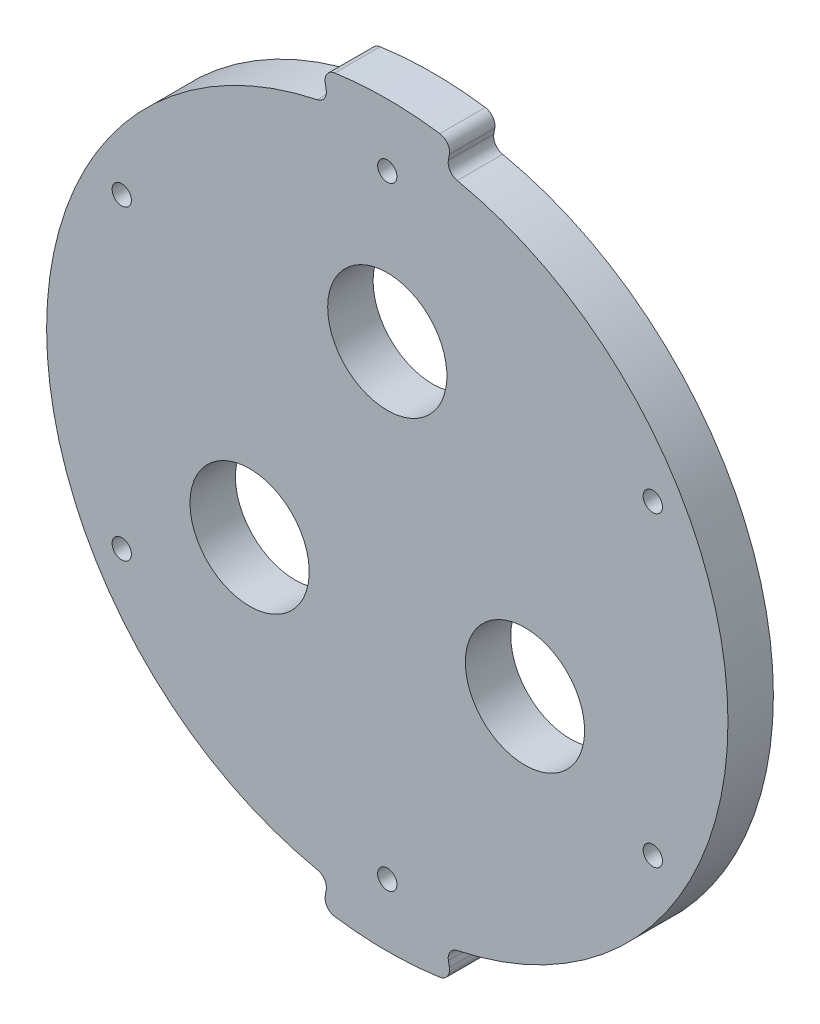
ISO-10303-21;
HEADER;
FILE_DESCRIPTION(('STEP AP214'),'2;1');
FILE_NAME('part.step','',(''),(''),'','','');
FILE_SCHEMA(('AUTOMOTIVE_DESIGN { 1 0 10303 214 1 1 1 1 }'));
ENDSEC;
DATA;
#1=APPLICATION_CONTEXT('core data for automotive mechanical design processes');
#2=APPLICATION_PROTOCOL_DEFINITION('international standard','automotive_design',2000,#1);
#3=PRODUCT_CONTEXT('',#1,'mechanical');
#4=PRODUCT('Part','Part','',(#3));
#5=PRODUCT_RELATED_PRODUCT_CATEGORY('part','',(#4));
#6=PRODUCT_DEFINITION_FORMATION('','',#4);
#7=PRODUCT_DEFINITION_CONTEXT('part definition',#1,'design');
#8=PRODUCT_DEFINITION('design','',#6,#7);
#9=PRODUCT_DEFINITION_SHAPE('','',#8);
#10=(LENGTH_UNIT() NAMED_UNIT(*) SI_UNIT(.MILLI.,.METRE.));
#11=(NAMED_UNIT(*) PLANE_ANGLE_UNIT() SI_UNIT($,.RADIAN.));
#12=(NAMED_UNIT(*) SI_UNIT($,.STERADIAN.) SOLID_ANGLE_UNIT());
#13=UNCERTAINTY_MEASURE_WITH_UNIT(LENGTH_MEASURE(1.E-05),#10,'distance_accuracy_value','');
#14=(GEOMETRIC_REPRESENTATION_CONTEXT(3) GLOBAL_UNCERTAINTY_ASSIGNED_CONTEXT((#13)) GLOBAL_UNIT_ASSIGNED_CONTEXT((#10,
#11,#12)) REPRESENTATION_CONTEXT('',''));
#15=CARTESIAN_POINT('',(0.,0.,0.));
#16=DIRECTION('',(0.,0.,1.));
#17=DIRECTION('',(1.,0.,0.));
#18=AXIS2_PLACEMENT_3D('',#15,#16,#17);
#19=CARTESIAN_POINT('',(0.,0.,0.));
#20=DIRECTION('',(0.,0.,1.));
#21=DIRECTION('',(1.,0.,0.));
#22=AXIS2_PLACEMENT_3D('',#19,#20,#21);
#23=PLANE('',#22);
#24=CARTESIAN_POINT('',(0.,28.,0.));
#25=DIRECTION('',(0.,0.,-1.));
#26=DIRECTION('',(-1.,0.,0.));
#27=AXIS2_PLACEMENT_3D('',#24,#25,#26);
#28=CIRCLE('',#27,10.5);
#29=CARTESIAN_POINT('',(-10.5,28.,0.));
#30=VERTEX_POINT('',#29);
#31=EDGE_CURVE('E827',#30,#30,#28,.T.);
#32=ORIENTED_EDGE('',*,*,#31,.F.);
#33=EDGE_LOOP('',(#32));
#34=FACE_BOUND('',#33,.T.);
#35=CARTESIAN_POINT('',(-24.2487113059661,-13.999999999999,0.));
#36=DIRECTION('',(0.,0.,-1.));
#37=DIRECTION('',(-1.,0.,0.));
#38=AXIS2_PLACEMENT_3D('',#35,#36,#37);
#39=CIRCLE('',#38,10.5000000000015);
#40=CARTESIAN_POINT('',(-34.7487113059676,-13.999999999999,0.));
#41=VERTEX_POINT('',#40);
#42=EDGE_CURVE('E829',#41,#41,#39,.T.);
#43=ORIENTED_EDGE('',*,*,#42,.F.);
#44=EDGE_LOOP('',(#43));
#45=FACE_BOUND('',#44,.T.);
#46=CARTESIAN_POINT('',(24.2487113059625,-14.000000000001,0.));
#47=DIRECTION('',(0.,0.,-1.));
#48=DIRECTION('',(-1.,0.,0.));
#49=AXIS2_PLACEMENT_3D('',#46,#47,#48);
#50=CIRCLE('',#49,10.5000000000023);
#51=CARTESIAN_POINT('',(13.7487113059602,-14.000000000001,0.));
#52=VERTEX_POINT('',#51);
#53=EDGE_CURVE('E844',#52,#52,#50,.T.);
#54=ORIENTED_EDGE('',*,*,#53,.F.);
#55=EDGE_LOOP('',(#54));
#56=FACE_BOUND('',#55,.T.);
#57=CARTESIAN_POINT('',(-46.7653718043612,27.0000000000027,0.));
#58=DIRECTION('',(0.,0.,-1.));
#59=DIRECTION('',(-1.,0.,0.));
#60=AXIS2_PLACEMENT_3D('',#57,#58,#59);
#61=CIRCLE('',#60,1.725);
#62=CARTESIAN_POINT('',(-48.4903718043612,27.0000000000027,0.));
#63=VERTEX_POINT('',#62);
#64=EDGE_CURVE('E867',#63,#63,#61,.T.);
#65=ORIENTED_EDGE('',*,*,#64,.F.);
#66=EDGE_LOOP('',(#65));
#67=FACE_BOUND('',#66,.T.);
#68=CARTESIAN_POINT('',(-6.11887169335264E-12,-54.,0.));
#69=DIRECTION('',(0.,0.,-1.));
#70=DIRECTION('',(-1.,0.,0.));
#71=AXIS2_PLACEMENT_3D('',#68,#69,#70);
#72=CIRCLE('',#71,1.725);
#73=CARTESIAN_POINT('',(-1.72500000000612,-54.,0.));
#74=VERTEX_POINT('',#73);
#75=EDGE_CURVE('E891',#74,#74,#72,.T.);
#76=ORIENTED_EDGE('',*,*,#75,.F.);
#77=EDGE_LOOP('',(#76));
#78=FACE_BOUND('',#77,.T.);
#79=CARTESIAN_POINT('',(0.,0.,0.));
#80=DIRECTION('',(0.,0.,1.));
#81=DIRECTION('',(1.,0.,0.));
#82=AXIS2_PLACEMENT_3D('',#79,#80,#81);
#83=CIRCLE('',#82,65.);
#84=CARTESIAN_POINT('',(9.24929948716635,-64.3385612132935,0.));
#85=VERTEX_POINT('',#84);
#86=CARTESIAN_POINT('',(-9.2492994871958,-64.3385612132892,0.));
#87=VERTEX_POINT('',#86);
#88=EDGE_CURVE('E169',#85,#87,#83,.F.);
#89=ORIENTED_EDGE('',*,*,#88,.T.);
#90=CARTESIAN_POINT('',(-8.96470565682054,-62.3589131759572,0.));
#91=DIRECTION('',(0.,0.,1.));
#92=DIRECTION('',(1.,0.,0.));
#93=AXIS2_PLACEMENT_3D('',#90,#91,#92);
#94=CIRCLE('',#93,2.);
#95=CARTESIAN_POINT('',(-10.9343211628449,-62.0116168206229,0.));
#96=VERTEX_POINT('',#95);
#97=EDGE_CURVE('E163',#87,#96,#94,.F.);
#98=ORIENTED_EDGE('',*,*,#97,.T.);
#99=DIRECTION('',(0.173648177667149,0.984807753012169,0.));
#100=VECTOR('',#99,1.);
#101=CARTESIAN_POINT('',(-10.4188906600289,-59.0884651807302,0.));
#102=LINE('',#101,#100);
#103=CARTESIAN_POINT('',(-10.7605840032661,-61.0263044261133,0.));
#104=VERTEX_POINT('',#103);
#105=EDGE_CURVE('E166',#96,#104,#102,.T.);
#106=ORIENTED_EDGE('',*,*,#105,.T.);
#107=CARTESIAN_POINT('',(-12.7301995092905,-60.679008070779,0.));
#108=DIRECTION('',(0.,0.,1.));
#109=DIRECTION('',(1.,0.,0.));
#110=AXIS2_PLACEMENT_3D('',#107,#108,#109);
#111=CIRCLE('',#110,2.);
#112=CARTESIAN_POINT('',(-12.3195479122166,-58.7216207136571,0.));
#113=VERTEX_POINT('',#112);
#114=EDGE_CURVE('E327',#104,#113,#111,.T.);
#115=ORIENTED_EDGE('',*,*,#114,.T.);
#116=CARTESIAN_POINT('',(0.,0.,0.));
#117=DIRECTION('',(0.,0.,1.));
#118=DIRECTION('',(1.,0.,0.));
#119=AXIS2_PLACEMENT_3D('',#116,#117,#118);
#120=CIRCLE('',#119,60.);
#121=CARTESIAN_POINT('',(-12.3195479122032,58.7216207136599,0.));
#122=VERTEX_POINT('',#121);
#123=EDGE_CURVE('E228',#122,#113,#120,.T.);
#124=ORIENTED_EDGE('',*,*,#123,.F.);
#125=CARTESIAN_POINT('',(-12.7301995092766,60.6790080707819,0.));
#126=DIRECTION('',(0.,0.,1.));
#127=DIRECTION('',(1.,0.,0.));
#128=AXIS2_PLACEMENT_3D('',#125,#126,#127);
#129=CIRCLE('',#128,2.);
#130=CARTESIAN_POINT('',(-10.7605840032522,61.0263044261157,0.));
#131=VERTEX_POINT('',#130);
#132=EDGE_CURVE('E12',#122,#131,#129,.T.);
#133=ORIENTED_EDGE('',*,*,#132,.T.);
#134=DIRECTION('',(-0.173648177666924,0.984807753012209,0.));
#135=VECTOR('',#134,1.);
#136=CARTESIAN_POINT('',(-10.4188906600154,59.0884651807326,0.));
#137=LINE('',#136,#135);
#138=CARTESIAN_POINT('',(-10.9343211628307,62.0116168206254,0.));
#139=VERTEX_POINT('',#138);
#140=EDGE_CURVE('E223',#131,#139,#137,.T.);
#141=ORIENTED_EDGE('',*,*,#140,.T.);
#142=CARTESIAN_POINT('',(-8.96470565680627,62.3589131759593,0.));
#143=DIRECTION('',(0.,0.,1.));
#144=DIRECTION('',(1.,0.,0.));
#145=AXIS2_PLACEMENT_3D('',#142,#143,#144);
#146=CIRCLE('',#145,2.);
#147=CARTESIAN_POINT('',(-9.24929948718107,64.3385612132913,0.));
#148=VERTEX_POINT('',#147);
#149=EDGE_CURVE('E276',#139,#148,#146,.F.);
#150=ORIENTED_EDGE('',*,*,#149,.T.);
#151=CARTESIAN_POINT('',(0.,0.,0.));
#152=DIRECTION('',(0.,0.,1.));
#153=DIRECTION('',(1.,0.,0.));
#154=AXIS2_PLACEMENT_3D('',#151,#152,#153);
#155=CIRCLE('',#154,65.);
#156=CARTESIAN_POINT('',(9.24929948718107,64.3385612132913,0.));
#157=VERTEX_POINT('',#156);
#158=EDGE_CURVE('E215',#148,#157,#155,.F.);
#159=ORIENTED_EDGE('',*,*,#158,.T.);
#160=CARTESIAN_POINT('',(8.96470565680627,62.3589131759593,0.));
#161=DIRECTION('',(0.,0.,1.));
#162=DIRECTION('',(1.,0.,0.));
#163=AXIS2_PLACEMENT_3D('',#160,#161,#162);
#164=CIRCLE('',#163,2.);
#165=CARTESIAN_POINT('',(10.9343211628307,62.0116168206254,0.));
#166=VERTEX_POINT('',#165);
#167=EDGE_CURVE('E279',#157,#166,#164,.F.);
#168=ORIENTED_EDGE('',*,*,#167,.T.);
#169=DIRECTION('',(-0.173648177666923,-0.984807753012209,0.));
#170=VECTOR('',#169,1.);
#171=CARTESIAN_POINT('',(10.4188906600154,59.0884651807326,0.));
#172=LINE('',#171,#170);
#173=CARTESIAN_POINT('',(10.7605840032522,61.0263044261157,0.));
#174=VERTEX_POINT('',#173);
#175=EDGE_CURVE('E219',#166,#174,#172,.T.);
#176=ORIENTED_EDGE('',*,*,#175,.T.);
#177=CARTESIAN_POINT('',(12.7301995092766,60.6790080707819,0.));
#178=DIRECTION('',(0.,0.,1.));
#179=DIRECTION('',(1.,0.,0.));
#180=AXIS2_PLACEMENT_3D('',#177,#178,#179);
#181=CIRCLE('',#180,2.);
#182=CARTESIAN_POINT('',(12.3195479122032,58.7216207136599,0.));
#183=VERTEX_POINT('',#182);
#184=EDGE_CURVE('E338',#174,#183,#181,.T.);
#185=ORIENTED_EDGE('',*,*,#184,.T.);
#186=CARTESIAN_POINT('',(12.3195479121897,-58.7216207136627,0.));
#187=VERTEX_POINT('',#186);
#188=EDGE_CURVE('E222',#187,#183,#120,.T.);
#189=ORIENTED_EDGE('',*,*,#188,.F.);
#190=CARTESIAN_POINT('',(12.7301995092627,-60.6790080707848,0.));
#191=DIRECTION('',(0.,0.,1.));
#192=DIRECTION('',(1.,0.,0.));
#193=AXIS2_PLACEMENT_3D('',#190,#191,#192);
#194=CIRCLE('',#193,2.);
#195=CARTESIAN_POINT('',(10.7605840032382,-61.0263044261182,0.));
#196=VERTEX_POINT('',#195);
#197=EDGE_CURVE('E71',#187,#196,#194,.T.);
#198=ORIENTED_EDGE('',*,*,#197,.T.);
#199=DIRECTION('',(0.173648177666698,-0.984807753012249,0.));
#200=VECTOR('',#199,1.);
#201=CARTESIAN_POINT('',(10.4188906600019,-59.0884651807349,0.));
#202=LINE('',#201,#200);
#203=CARTESIAN_POINT('',(10.9343211628165,-62.0116168206279,0.));
#204=VERTEX_POINT('',#203);
#205=EDGE_CURVE('E186',#196,#204,#202,.T.);
#206=ORIENTED_EDGE('',*,*,#205,.T.);
#207=CARTESIAN_POINT('',(8.964705656792,-62.3589131759613,0.));
#208=DIRECTION('',(0.,0.,1.));
#209=DIRECTION('',(1.,0.,0.));
#210=AXIS2_PLACEMENT_3D('',#207,#208,#209);
#211=CIRCLE('',#210,2.);
#212=EDGE_CURVE('E175',#204,#85,#211,.F.);
#213=ORIENTED_EDGE('',*,*,#212,.T.);
#214=EDGE_LOOP('',(#89,#98,#106,#115,#124,#133,#141,#150,#159,#168,#176,#185,#189,#198,#206,#213));
#215=FACE_BOUND('',#214,.T.);
#216=CARTESIAN_POINT('',(46.7653718043582,26.9999999999974,0.));
#217=DIRECTION('',(0.,0.,-1.));
#218=DIRECTION('',(-1.,0.,0.));
#219=AXIS2_PLACEMENT_3D('',#216,#217,#218);
#220=CIRCLE('',#219,1.725);
#221=CARTESIAN_POINT('',(45.0403718043582,26.9999999999974,0.));
#222=VERTEX_POINT('',#221);
#223=EDGE_CURVE('E409',#222,#222,#220,.T.);
#224=ORIENTED_EDGE('',*,*,#223,.F.);
#225=EDGE_LOOP('',(#224));
#226=FACE_BOUND('',#225,.T.);
#227=CARTESIAN_POINT('',(46.7653718043551,-27.0000000000027,0.));
#228=DIRECTION('',(0.,0.,-1.));
#229=DIRECTION('',(-1.,0.,0.));
#230=AXIS2_PLACEMENT_3D('',#227,#228,#229);
#231=CIRCLE('',#230,1.725);
#232=CARTESIAN_POINT('',(45.0403718043551,-27.0000000000027,0.));
#233=VERTEX_POINT('',#232);
#234=EDGE_CURVE('E430',#233,#233,#231,.T.);
#235=ORIENTED_EDGE('',*,*,#234,.F.);
#236=EDGE_LOOP('',(#235));
#237=FACE_BOUND('',#236,.T.);
#238=CARTESIAN_POINT('',(-46.7653718043643,-26.9999999999973,0.));
#239=DIRECTION('',(0.,0.,-1.));
#240=DIRECTION('',(-1.,0.,0.));
#241=AXIS2_PLACEMENT_3D('',#238,#239,#240);
#242=CIRCLE('',#241,1.725);
#243=CARTESIAN_POINT('',(-48.4903718043643,-26.9999999999973,0.));
#244=VERTEX_POINT('',#243);
#245=EDGE_CURVE('E880',#244,#244,#242,.T.);
#246=ORIENTED_EDGE('',*,*,#245,.F.);
#247=EDGE_LOOP('',(#246));
#248=FACE_BOUND('',#247,.T.);
#249=CARTESIAN_POINT('',(0.,54.,0.));
#250=DIRECTION('',(0.,0.,-1.));
#251=DIRECTION('',(-1.,0.,0.));
#252=AXIS2_PLACEMENT_3D('',#249,#250,#251);
#253=CIRCLE('',#252,1.725);
#254=CARTESIAN_POINT('',(-1.725,54.,0.));
#255=VERTEX_POINT('',#254);
#256=EDGE_CURVE('E833',#255,#255,#253,.T.);
#257=ORIENTED_EDGE('',*,*,#256,.F.);
#258=EDGE_LOOP('',(#257));
#259=FACE_BOUND('',#258,.T.);
#260=ADVANCED_FACE('F48',(#34,#45,#56,#67,#78,#215,#226,#237,#248,#259),#23,.F.);
#261=CARTESIAN_POINT('',(0.,0.,8.));
#262=DIRECTION('',(0.,0.,-1.));
#263=DIRECTION('',(-1.,0.,0.));
#264=AXIS2_PLACEMENT_3D('',#261,#262,#263);
#265=CYLINDRICAL_SURFACE('',#264,60.);
#266=CARTESIAN_POINT('',(0.,0.,8.));
#267=DIRECTION('',(0.,0.,1.));
#268=DIRECTION('',(1.,0.,0.));
#269=AXIS2_PLACEMENT_3D('',#266,#267,#268);
#270=CIRCLE('',#269,60.);
#271=CARTESIAN_POINT('',(12.3195479121897,-58.7216207136627,8.));
#272=VERTEX_POINT('',#271);
#273=CARTESIAN_POINT('',(12.3195479122032,58.7216207136599,8.));
#274=VERTEX_POINT('',#273);
#275=EDGE_CURVE('E224',#272,#274,#270,.T.);
#276=ORIENTED_EDGE('',*,*,#275,.F.);
#277=DIRECTION('',(0.,0.,-1.));
#278=VECTOR('',#277,1.);
#279=CARTESIAN_POINT('',(12.3195479121897,-58.7216207136627,8.));
#280=LINE('',#279,#278);
#281=EDGE_CURVE('E300',#272,#187,#280,.T.);
#282=ORIENTED_EDGE('',*,*,#281,.T.);
#283=ORIENTED_EDGE('',*,*,#188,.T.);
#284=DIRECTION('',(0.,0.,-1.));
#285=VECTOR('',#284,1.);
#286=CARTESIAN_POINT('',(12.3195479122032,58.7216207136599,8.));
#287=LINE('',#286,#285);
#288=EDGE_CURVE('E296',#183,#274,#287,.F.);
#289=ORIENTED_EDGE('',*,*,#288,.T.);
#290=EDGE_LOOP('',(#276,#282,#283,#289));
#291=FACE_BOUND('',#290,.T.);
#292=ADVANCED_FACE('F386',(#291),#265,.T.);
#293=ORIENTED_EDGE('',*,*,#123,.T.);
#294=DIRECTION('',(0.,0.,-1.));
#295=VECTOR('',#294,1.);
#296=CARTESIAN_POINT('',(-12.3195479122166,-58.7216207136571,8.));
#297=LINE('',#296,#295);
#298=CARTESIAN_POINT('',(-12.3195479122166,-58.7216207136571,8.));
#299=VERTEX_POINT('',#298);
#300=EDGE_CURVE('E286',#113,#299,#297,.F.);
#301=ORIENTED_EDGE('',*,*,#300,.T.);
#302=CARTESIAN_POINT('',(-12.3195479122032,58.7216207136599,8.));
#303=VERTEX_POINT('',#302);
#304=EDGE_CURVE('E198',#303,#299,#270,.T.);
#305=ORIENTED_EDGE('',*,*,#304,.F.);
#306=DIRECTION('',(0.,0.,-1.));
#307=VECTOR('',#306,1.);
#308=CARTESIAN_POINT('',(-12.3195479122032,58.7216207136599,8.));
#309=LINE('',#308,#307);
#310=EDGE_CURVE('E174',#303,#122,#309,.T.);
#311=ORIENTED_EDGE('',*,*,#310,.T.);
#312=EDGE_LOOP('',(#293,#301,#305,#311));
#313=FACE_BOUND('',#312,.T.);
#314=ADVANCED_FACE('F351',(#313),#265,.T.);
#315=CARTESIAN_POINT('',(0.,0.,8.));
#316=DIRECTION('',(0.,0.,1.));
#317=DIRECTION('',(1.,0.,0.));
#318=AXIS2_PLACEMENT_3D('',#315,#316,#317);
#319=PLANE('',#318);
#320=CARTESIAN_POINT('',(0.,28.,8.));
#321=DIRECTION('',(0.,0.,-1.));
#322=DIRECTION('',(-1.,0.,0.));
#323=AXIS2_PLACEMENT_3D('',#320,#321,#322);
#324=CIRCLE('',#323,10.5);
#325=CARTESIAN_POINT('',(-10.5,28.,8.));
#326=VERTEX_POINT('',#325);
#327=EDGE_CURVE('E825',#326,#326,#324,.T.);
#328=ORIENTED_EDGE('',*,*,#327,.T.);
#329=EDGE_LOOP('',(#328));
#330=FACE_BOUND('',#329,.T.);
#331=CARTESIAN_POINT('',(-24.2487113059661,-13.999999999999,8.));
#332=DIRECTION('',(0.,0.,-1.));
#333=DIRECTION('',(-1.,0.,0.));
#334=AXIS2_PLACEMENT_3D('',#331,#332,#333);
#335=CIRCLE('',#334,10.5000000000015);
#336=CARTESIAN_POINT('',(-34.7487113059676,-13.999999999999,8.));
#337=VERTEX_POINT('',#336);
#338=EDGE_CURVE('E836',#337,#337,#335,.T.);
#339=ORIENTED_EDGE('',*,*,#338,.T.);
#340=EDGE_LOOP('',(#339));
#341=FACE_BOUND('',#340,.T.);
#342=CARTESIAN_POINT('',(24.2487113059625,-14.000000000001,8.));
#343=DIRECTION('',(0.,0.,-1.));
#344=DIRECTION('',(-1.,0.,0.));
#345=AXIS2_PLACEMENT_3D('',#342,#343,#344);
#346=CIRCLE('',#345,10.5000000000023);
#347=CARTESIAN_POINT('',(13.7487113059602,-14.000000000001,8.));
#348=VERTEX_POINT('',#347);
#349=EDGE_CURVE('E851',#348,#348,#346,.T.);
#350=ORIENTED_EDGE('',*,*,#349,.T.);
#351=EDGE_LOOP('',(#350));
#352=FACE_BOUND('',#351,.T.);
#353=CARTESIAN_POINT('',(0.,54.,8.));
#354=DIRECTION('',(0.,0.,1.));
#355=DIRECTION('',(1.,0.,0.));
#356=AXIS2_PLACEMENT_3D('',#353,#354,#355);
#357=CIRCLE('',#356,1.69999999999999);
#358=CARTESIAN_POINT('',(1.69999999999999,54.,8.));
#359=VERTEX_POINT('',#358);
#360=EDGE_CURVE('E862',#359,#359,#357,.T.);
#361=ORIENTED_EDGE('',*,*,#360,.F.);
#362=EDGE_LOOP('',(#361));
#363=FACE_BOUND('',#362,.T.);
#364=CARTESIAN_POINT('',(-46.7653718043612,27.0000000000027,8.));
#365=DIRECTION('',(0.,0.,1.));
#366=DIRECTION('',(1.,0.,0.));
#367=AXIS2_PLACEMENT_3D('',#364,#365,#366);
#368=CIRCLE('',#367,1.69999999999999);
#369=CARTESIAN_POINT('',(-45.0653718043612,27.0000000000027,8.));
#370=VERTEX_POINT('',#369);
#371=EDGE_CURVE('E875',#370,#370,#368,.T.);
#372=ORIENTED_EDGE('',*,*,#371,.F.);
#373=EDGE_LOOP('',(#372));
#374=FACE_BOUND('',#373,.T.);
#375=CARTESIAN_POINT('',(-46.7653718043643,-26.9999999999973,8.));
#376=DIRECTION('',(0.,0.,1.));
#377=DIRECTION('',(1.,0.,0.));
#378=AXIS2_PLACEMENT_3D('',#375,#376,#377);
#379=CIRCLE('',#378,1.69999999999999);
#380=CARTESIAN_POINT('',(-45.0653718043643,-26.9999999999973,8.));
#381=VERTEX_POINT('',#380);
#382=EDGE_CURVE('E887',#381,#381,#379,.T.);
#383=ORIENTED_EDGE('',*,*,#382,.F.);
#384=EDGE_LOOP('',(#383));
#385=FACE_BOUND('',#384,.T.);
#386=CARTESIAN_POINT('',(-6.11887169335264E-12,-54.,8.));
#387=DIRECTION('',(0.,0.,1.));
#388=DIRECTION('',(1.,0.,0.));
#389=AXIS2_PLACEMENT_3D('',#386,#387,#388);
#390=CIRCLE('',#389,1.69999999999999);
#391=CARTESIAN_POINT('',(1.69999999999387,-54.,8.));
#392=VERTEX_POINT('',#391);
#393=EDGE_CURVE('E425',#392,#392,#390,.T.);
#394=ORIENTED_EDGE('',*,*,#393,.F.);
#395=EDGE_LOOP('',(#394));
#396=FACE_BOUND('',#395,.T.);
#397=CARTESIAN_POINT('',(46.7653718043551,-27.0000000000027,8.));
#398=DIRECTION('',(0.,0.,1.));
#399=DIRECTION('',(1.,0.,0.));
#400=AXIS2_PLACEMENT_3D('',#397,#398,#399);
#401=CIRCLE('',#400,1.69999999999999);
#402=CARTESIAN_POINT('',(48.4653718043551,-27.0000000000027,8.));
#403=VERTEX_POINT('',#402);
#404=EDGE_CURVE('E413',#403,#403,#401,.T.);
#405=ORIENTED_EDGE('',*,*,#404,.F.);
#406=EDGE_LOOP('',(#405));
#407=FACE_BOUND('',#406,.T.);
#408=CARTESIAN_POINT('',(46.7653718043582,26.9999999999974,8.));
#409=DIRECTION('',(0.,0.,1.));
#410=DIRECTION('',(1.,0.,0.));
#411=AXIS2_PLACEMENT_3D('',#408,#409,#410);
#412=CIRCLE('',#411,1.69999999999999);
#413=CARTESIAN_POINT('',(48.4653718043582,26.9999999999974,8.));
#414=VERTEX_POINT('',#413);
#415=EDGE_CURVE('E187',#414,#414,#412,.T.);
#416=ORIENTED_EDGE('',*,*,#415,.F.);
#417=EDGE_LOOP('',(#416));
#418=FACE_BOUND('',#417,.T.);
#419=DIRECTION('',(-0.173648177667149,-0.984807753012169,0.));
#420=VECTOR('',#419,1.);
#421=CARTESIAN_POINT('',(-10.4188906600289,-59.0884651807302,8.));
#422=LINE('',#421,#420);
#423=CARTESIAN_POINT('',(-10.7605840032661,-61.0263044261133,8.));
#424=VERTEX_POINT('',#423);
#425=CARTESIAN_POINT('',(-10.9343211628449,-62.0116168206229,8.));
#426=VERTEX_POINT('',#425);
#427=EDGE_CURVE('E240',#424,#426,#422,.T.);
#428=ORIENTED_EDGE('',*,*,#427,.T.);
#429=CARTESIAN_POINT('',(-8.96470565682054,-62.3589131759572,8.));
#430=DIRECTION('',(0.,0.,1.));
#431=DIRECTION('',(1.,0.,0.));
#432=AXIS2_PLACEMENT_3D('',#429,#430,#431);
#433=CIRCLE('',#432,2.);
#434=CARTESIAN_POINT('',(-9.2492994871958,-64.3385612132892,8.));
#435=VERTEX_POINT('',#434);
#436=EDGE_CURVE('E190',#426,#435,#433,.T.);
#437=ORIENTED_EDGE('',*,*,#436,.T.);
#438=CARTESIAN_POINT('',(0.,0.,8.));
#439=DIRECTION('',(0.,0.,1.));
#440=DIRECTION('',(-1.,0.,0.));
#441=AXIS2_PLACEMENT_3D('',#438,#439,#440);
#442=CIRCLE('',#441,65.);
#443=CARTESIAN_POINT('',(9.24929948716635,-64.3385612132935,8.));
#444=VERTEX_POINT('',#443);
#445=EDGE_CURVE('E255',#435,#444,#442,.T.);
#446=ORIENTED_EDGE('',*,*,#445,.T.);
#447=CARTESIAN_POINT('',(8.964705656792,-62.3589131759613,8.));
#448=DIRECTION('',(0.,0.,1.));
#449=DIRECTION('',(1.,0.,0.));
#450=AXIS2_PLACEMENT_3D('',#447,#448,#449);
#451=CIRCLE('',#450,2.);
#452=CARTESIAN_POINT('',(10.9343211628165,-62.0116168206279,8.));
#453=VERTEX_POINT('',#452);
#454=EDGE_CURVE('E268',#444,#453,#451,.T.);
#455=ORIENTED_EDGE('',*,*,#454,.T.);
#456=DIRECTION('',(-0.173648177666698,0.984807753012249,0.));
#457=VECTOR('',#456,1.);
#458=CARTESIAN_POINT('',(10.4188906600019,-59.0884651807349,8.));
#459=LINE('',#458,#457);
#460=CARTESIAN_POINT('',(10.7605840032382,-61.0263044261182,8.));
#461=VERTEX_POINT('',#460);
#462=EDGE_CURVE('E249',#453,#461,#459,.T.);
#463=ORIENTED_EDGE('',*,*,#462,.T.);
#464=CARTESIAN_POINT('',(12.7301995092627,-60.6790080707848,8.));
#465=DIRECTION('',(0.,0.,1.));
#466=DIRECTION('',(1.,0.,0.));
#467=AXIS2_PLACEMENT_3D('',#464,#465,#466);
#468=CIRCLE('',#467,2.);
#469=EDGE_CURVE('E330',#461,#272,#468,.F.);
#470=ORIENTED_EDGE('',*,*,#469,.T.);
#471=ORIENTED_EDGE('',*,*,#275,.T.);
#472=CARTESIAN_POINT('',(12.7301995092766,60.6790080707819,8.));
#473=DIRECTION('',(0.,0.,1.));
#474=DIRECTION('',(1.,0.,0.));
#475=AXIS2_PLACEMENT_3D('',#472,#473,#474);
#476=CIRCLE('',#475,2.);
#477=CARTESIAN_POINT('',(10.7605840032522,61.0263044261157,8.));
#478=VERTEX_POINT('',#477);
#479=EDGE_CURVE('E335',#274,#478,#476,.F.);
#480=ORIENTED_EDGE('',*,*,#479,.T.);
#481=DIRECTION('',(0.173648177666923,0.984807753012209,0.));
#482=VECTOR('',#481,1.);
#483=CARTESIAN_POINT('',(10.4188906600154,59.0884651807326,8.));
#484=LINE('',#483,#482);
#485=CARTESIAN_POINT('',(10.9343211628307,62.0116168206254,8.));
#486=VERTEX_POINT('',#485);
#487=EDGE_CURVE('E235',#478,#486,#484,.T.);
#488=ORIENTED_EDGE('',*,*,#487,.T.);
#489=CARTESIAN_POINT('',(8.96470565680627,62.3589131759593,8.));
#490=DIRECTION('',(0.,0.,1.));
#491=DIRECTION('',(1.,0.,0.));
#492=AXIS2_PLACEMENT_3D('',#489,#490,#491);
#493=CIRCLE('',#492,2.);
#494=CARTESIAN_POINT('',(9.24929948718107,64.3385612132913,8.));
#495=VERTEX_POINT('',#494);
#496=EDGE_CURVE('E196',#486,#495,#493,.T.);
#497=ORIENTED_EDGE('',*,*,#496,.T.);
#498=CARTESIAN_POINT('',(0.,0.,8.));
#499=DIRECTION('',(0.,0.,1.));
#500=DIRECTION('',(-1.,0.,0.));
#501=AXIS2_PLACEMENT_3D('',#498,#499,#500);
#502=CIRCLE('',#501,65.);
#503=CARTESIAN_POINT('',(-9.24929948718107,64.3385612132913,8.));
#504=VERTEX_POINT('',#503);
#505=EDGE_CURVE('E216',#495,#504,#502,.T.);
#506=ORIENTED_EDGE('',*,*,#505,.T.);
#507=CARTESIAN_POINT('',(-8.96470565680627,62.3589131759593,8.));
#508=DIRECTION('',(0.,0.,1.));
#509=DIRECTION('',(1.,0.,0.));
#510=AXIS2_PLACEMENT_3D('',#507,#508,#509);
#511=CIRCLE('',#510,2.);
#512=CARTESIAN_POINT('',(-10.9343211628307,62.0116168206254,8.));
#513=VERTEX_POINT('',#512);
#514=EDGE_CURVE('E192',#504,#513,#511,.T.);
#515=ORIENTED_EDGE('',*,*,#514,.T.);
#516=DIRECTION('',(0.173648177666924,-0.984807753012209,0.));
#517=VECTOR('',#516,1.);
#518=CARTESIAN_POINT('',(-10.4188906600154,59.0884651807326,8.));
#519=LINE('',#518,#517);
#520=CARTESIAN_POINT('',(-10.7605840032522,61.0263044261157,8.));
#521=VERTEX_POINT('',#520);
#522=EDGE_CURVE('E210',#513,#521,#519,.T.);
#523=ORIENTED_EDGE('',*,*,#522,.T.);
#524=CARTESIAN_POINT('',(-12.7301995092766,60.6790080707819,8.));
#525=DIRECTION('',(0.,0.,1.));
#526=DIRECTION('',(1.,0.,0.));
#527=AXIS2_PLACEMENT_3D('',#524,#525,#526);
#528=CIRCLE('',#527,2.);
#529=EDGE_CURVE('E57',#521,#303,#528,.F.);
#530=ORIENTED_EDGE('',*,*,#529,.T.);
#531=ORIENTED_EDGE('',*,*,#304,.T.);
#532=CARTESIAN_POINT('',(-12.7301995092905,-60.679008070779,8.));
#533=DIRECTION('',(0.,0.,1.));
#534=DIRECTION('',(1.,0.,0.));
#535=AXIS2_PLACEMENT_3D('',#532,#533,#534);
#536=CIRCLE('',#535,2.);
#537=EDGE_CURVE('E324',#299,#424,#536,.F.);
#538=ORIENTED_EDGE('',*,*,#537,.T.);
#539=EDGE_LOOP('',(#428,#437,#446,#455,#463,#470,#471,#480,#488,#497,#506,#515,#523,#530,#531,#538));
#540=FACE_BOUND('',#539,.T.);
#541=ADVANCED_FACE('F344',(#330,#341,#352,#363,#374,#385,#396,#407,#418,#540),#319,.T.);
#542=CARTESIAN_POINT('',(-10.4188906600154,59.0884651807326,-23.3354579616187));
#543=DIRECTION('',(-0.984807753012209,-0.173648177666924,0.));
#544=DIRECTION('',(0.173648177666924,-0.984807753012209,0.));
#545=AXIS2_PLACEMENT_3D('',#542,#543,#544);
#546=PLANE('',#545);
#547=ORIENTED_EDGE('',*,*,#522,.F.);
#548=DIRECTION('',(0.,0.,1.));
#549=VECTOR('',#548,1.);
#550=CARTESIAN_POINT('',(-10.9343211628307,62.0116168206254,-23.3354579616187));
#551=LINE('',#550,#549);
#552=EDGE_CURVE('E321',#513,#139,#551,.F.);
#553=ORIENTED_EDGE('',*,*,#552,.T.);
#554=ORIENTED_EDGE('',*,*,#140,.F.);
#555=DIRECTION('',(0.,0.,-1.));
#556=VECTOR('',#555,1.);
#557=CARTESIAN_POINT('',(-10.7605840032522,61.0263044261157,-23.3354579616187));
#558=LINE('',#557,#556);
#559=EDGE_CURVE('E317',#131,#521,#558,.F.);
#560=ORIENTED_EDGE('',*,*,#559,.T.);
#561=EDGE_LOOP('',(#547,#553,#554,#560));
#562=FACE_BOUND('',#561,.T.);
#563=ADVANCED_FACE('F359',(#562),#546,.T.);
#564=CARTESIAN_POINT('',(0.,0.,-23.3354579616187));
#565=DIRECTION('',(0.,0.,1.));
#566=DIRECTION('',(1.,0.,0.));
#567=AXIS2_PLACEMENT_3D('',#564,#565,#566);
#568=CYLINDRICAL_SURFACE('',#567,65.);
#569=ORIENTED_EDGE('',*,*,#505,.F.);
#570=DIRECTION('',(0.,0.,1.));
#571=VECTOR('',#570,1.);
#572=CARTESIAN_POINT('',(9.24929948718107,64.3385612132913,-23.3354579616187));
#573=LINE('',#572,#571);
#574=EDGE_CURVE('E314',#495,#157,#573,.F.);
#575=ORIENTED_EDGE('',*,*,#574,.T.);
#576=ORIENTED_EDGE('',*,*,#158,.F.);
#577=DIRECTION('',(0.,0.,1.));
#578=VECTOR('',#577,1.);
#579=CARTESIAN_POINT('',(-9.24929948718107,64.3385612132913,-23.3354579616187));
#580=LINE('',#579,#578);
#581=EDGE_CURVE('E310',#148,#504,#580,.T.);
#582=ORIENTED_EDGE('',*,*,#581,.T.);
#583=EDGE_LOOP('',(#569,#575,#576,#582));
#584=FACE_BOUND('',#583,.T.);
#585=ADVANCED_FACE('F368',(#584),#568,.T.);
#586=CARTESIAN_POINT('',(10.4188906600154,59.0884651807326,-23.3354579616187));
#587=DIRECTION('',(0.984807753012209,-0.173648177666923,0.));
#588=DIRECTION('',(0.173648177666923,0.984807753012209,0.));
#589=AXIS2_PLACEMENT_3D('',#586,#587,#588);
#590=PLANE('',#589);
#591=ORIENTED_EDGE('',*,*,#487,.F.);
#592=DIRECTION('',(0.,0.,-1.));
#593=VECTOR('',#592,1.);
#594=CARTESIAN_POINT('',(10.7605840032522,61.0263044261157,-23.3354579616187));
#595=LINE('',#594,#593);
#596=EDGE_CURVE('E307',#478,#174,#595,.T.);
#597=ORIENTED_EDGE('',*,*,#596,.T.);
#598=ORIENTED_EDGE('',*,*,#175,.F.);
#599=DIRECTION('',(0.,0.,1.));
#600=VECTOR('',#599,1.);
#601=CARTESIAN_POINT('',(10.9343211628307,62.0116168206254,-23.3354579616187));
#602=LINE('',#601,#600);
#603=EDGE_CURVE('E303',#166,#486,#602,.T.);
#604=ORIENTED_EDGE('',*,*,#603,.T.);
#605=EDGE_LOOP('',(#591,#597,#598,#604));
#606=FACE_BOUND('',#605,.T.);
#607=ADVANCED_FACE('F378',(#606),#590,.T.);
#608=CARTESIAN_POINT('',(10.4188906600019,-59.0884651807349,-23.3354579616187));
#609=DIRECTION('',(0.984807753012249,0.173648177666698,0.));
#610=DIRECTION('',(-0.173648177666698,0.984807753012249,0.));
#611=AXIS2_PLACEMENT_3D('',#608,#609,#610);
#612=PLANE('',#611);
#613=ORIENTED_EDGE('',*,*,#462,.F.);
#614=DIRECTION('',(0.,0.,1.));
#615=VECTOR('',#614,1.);
#616=CARTESIAN_POINT('',(10.9343211628165,-62.0116168206279,-23.3354579616187));
#617=LINE('',#616,#615);
#618=EDGE_CURVE('E64',#453,#204,#617,.F.);
#619=ORIENTED_EDGE('',*,*,#618,.T.);
#620=ORIENTED_EDGE('',*,*,#205,.F.);
#621=DIRECTION('',(0.,0.,-1.));
#622=VECTOR('',#621,1.);
#623=CARTESIAN_POINT('',(10.7605840032382,-61.0263044261182,-23.3354579616187));
#624=LINE('',#623,#622);
#625=EDGE_CURVE('E290',#196,#461,#624,.F.);
#626=ORIENTED_EDGE('',*,*,#625,.T.);
#627=EDGE_LOOP('',(#613,#619,#620,#626));
#628=FACE_BOUND('',#627,.T.);
#629=ADVANCED_FACE('F506',(#628),#612,.T.);
#630=CARTESIAN_POINT('',(0.,0.,-23.3354579616187));
#631=DIRECTION('',(0.,0.,1.));
#632=DIRECTION('',(1.,0.,0.));
#633=AXIS2_PLACEMENT_3D('',#630,#631,#632);
#634=CYLINDRICAL_SURFACE('',#633,65.);
#635=ORIENTED_EDGE('',*,*,#445,.F.);
#636=DIRECTION('',(0.,0.,1.));
#637=VECTOR('',#636,1.);
#638=CARTESIAN_POINT('',(-9.2492994871958,-64.3385612132892,-23.3354579616187));
#639=LINE('',#638,#637);
#640=EDGE_CURVE('E273',#435,#87,#639,.F.);
#641=ORIENTED_EDGE('',*,*,#640,.T.);
#642=ORIENTED_EDGE('',*,*,#88,.F.);
#643=DIRECTION('',(0.,0.,1.));
#644=VECTOR('',#643,1.);
#645=CARTESIAN_POINT('',(9.24929948716635,-64.3385612132934,-23.3354579616187));
#646=LINE('',#645,#644);
#647=EDGE_CURVE('E267',#85,#444,#646,.T.);
#648=ORIENTED_EDGE('',*,*,#647,.T.);
#649=EDGE_LOOP('',(#635,#641,#642,#648));
#650=FACE_BOUND('',#649,.T.);
#651=ADVANCED_FACE('F395',(#650),#634,.T.);
#652=CARTESIAN_POINT('',(-10.4188906600289,-59.0884651807302,-23.3354579616187));
#653=DIRECTION('',(-0.984807753012169,0.173648177667149,0.));
#654=DIRECTION('',(-0.173648177667149,-0.984807753012169,0.));
#655=AXIS2_PLACEMENT_3D('',#652,#653,#654);
#656=PLANE('',#655);
#657=ORIENTED_EDGE('',*,*,#105,.F.);
#658=DIRECTION('',(0.,0.,1.));
#659=VECTOR('',#658,1.);
#660=CARTESIAN_POINT('',(-10.9343211628449,-62.0116168206229,-23.3354579616187));
#661=LINE('',#660,#659);
#662=EDGE_CURVE('E181',#96,#426,#661,.T.);
#663=ORIENTED_EDGE('',*,*,#662,.T.);
#664=ORIENTED_EDGE('',*,*,#427,.F.);
#665=DIRECTION('',(0.,0.,-1.));
#666=VECTOR('',#665,1.);
#667=CARTESIAN_POINT('',(-10.7605840032661,-61.0263044261133,-23.3354579616187));
#668=LINE('',#667,#666);
#669=EDGE_CURVE('E184',#424,#104,#668,.T.);
#670=ORIENTED_EDGE('',*,*,#669,.T.);
#671=EDGE_LOOP('',(#657,#663,#664,#670));
#672=FACE_BOUND('',#671,.T.);
#673=ADVANCED_FACE('F179',(#672),#656,.T.);
#674=CARTESIAN_POINT('',(-8.96470565682054,-62.3589131759572,-23.3354579616187));
#675=DIRECTION('',(0.,0.,1.));
#676=DIRECTION('',(1.,0.,0.));
#677=AXIS2_PLACEMENT_3D('',#674,#675,#676);
#678=CYLINDRICAL_SURFACE('',#677,2.);
#679=ORIENTED_EDGE('',*,*,#97,.F.);
#680=ORIENTED_EDGE('',*,*,#640,.F.);
#681=ORIENTED_EDGE('',*,*,#436,.F.);
#682=ORIENTED_EDGE('',*,*,#662,.F.);
#683=EDGE_LOOP('',(#679,#680,#681,#682));
#684=FACE_BOUND('',#683,.T.);
#685=ADVANCED_FACE('F189',(#684),#678,.T.);
#686=CARTESIAN_POINT('',(-12.7301995092905,-60.679008070779,8.));
#687=DIRECTION('',(0.,0.,-1.));
#688=DIRECTION('',(-1.,0.,0.));
#689=AXIS2_PLACEMENT_3D('',#686,#687,#688);
#690=CYLINDRICAL_SURFACE('',#689,2.);
#691=ORIENTED_EDGE('',*,*,#114,.F.);
#692=ORIENTED_EDGE('',*,*,#669,.F.);
#693=ORIENTED_EDGE('',*,*,#537,.F.);
#694=ORIENTED_EDGE('',*,*,#300,.F.);
#695=EDGE_LOOP('',(#691,#692,#693,#694));
#696=FACE_BOUND('',#695,.T.);
#697=ADVANCED_FACE('F391',(#696),#690,.F.);
#698=CARTESIAN_POINT('',(8.964705656792,-62.3589131759613,-23.3354579616187));
#699=DIRECTION('',(0.,0.,1.));
#700=DIRECTION('',(1.,0.,0.));
#701=AXIS2_PLACEMENT_3D('',#698,#699,#700);
#702=CYLINDRICAL_SURFACE('',#701,2.);
#703=ORIENTED_EDGE('',*,*,#212,.F.);
#704=ORIENTED_EDGE('',*,*,#618,.F.);
#705=ORIENTED_EDGE('',*,*,#454,.F.);
#706=ORIENTED_EDGE('',*,*,#647,.F.);
#707=EDGE_LOOP('',(#703,#704,#705,#706));
#708=FACE_BOUND('',#707,.T.);
#709=ADVANCED_FACE('F474',(#708),#702,.T.);
#710=CARTESIAN_POINT('',(12.7301995092627,-60.6790080707848,8.));
#711=DIRECTION('',(0.,0.,-1.));
#712=DIRECTION('',(-1.,0.,0.));
#713=AXIS2_PLACEMENT_3D('',#710,#711,#712);
#714=CYLINDRICAL_SURFACE('',#713,2.);
#715=ORIENTED_EDGE('',*,*,#197,.F.);
#716=ORIENTED_EDGE('',*,*,#281,.F.);
#717=ORIENTED_EDGE('',*,*,#469,.F.);
#718=ORIENTED_EDGE('',*,*,#625,.F.);
#719=EDGE_LOOP('',(#715,#716,#717,#718));
#720=FACE_BOUND('',#719,.T.);
#721=ADVANCED_FACE('F477',(#720),#714,.F.);
#722=CARTESIAN_POINT('',(12.7301995092766,60.6790080707819,8.));
#723=DIRECTION('',(0.,0.,-1.));
#724=DIRECTION('',(-1.,0.,0.));
#725=AXIS2_PLACEMENT_3D('',#722,#723,#724);
#726=CYLINDRICAL_SURFACE('',#725,2.);
#727=ORIENTED_EDGE('',*,*,#184,.F.);
#728=ORIENTED_EDGE('',*,*,#596,.F.);
#729=ORIENTED_EDGE('',*,*,#479,.F.);
#730=ORIENTED_EDGE('',*,*,#288,.F.);
#731=EDGE_LOOP('',(#727,#728,#729,#730));
#732=FACE_BOUND('',#731,.T.);
#733=ADVANCED_FACE('F381',(#732),#726,.F.);
#734=CARTESIAN_POINT('',(8.96470565680627,62.3589131759593,-23.3354579616187));
#735=DIRECTION('',(0.,0.,1.));
#736=DIRECTION('',(1.,0.,0.));
#737=AXIS2_PLACEMENT_3D('',#734,#735,#736);
#738=CYLINDRICAL_SURFACE('',#737,2.);
#739=ORIENTED_EDGE('',*,*,#167,.F.);
#740=ORIENTED_EDGE('',*,*,#574,.F.);
#741=ORIENTED_EDGE('',*,*,#496,.F.);
#742=ORIENTED_EDGE('',*,*,#603,.F.);
#743=EDGE_LOOP('',(#739,#740,#741,#742));
#744=FACE_BOUND('',#743,.T.);
#745=ADVANCED_FACE('F372',(#744),#738,.T.);
#746=CARTESIAN_POINT('',(-8.96470565680627,62.3589131759593,-23.3354579616187));
#747=DIRECTION('',(0.,0.,1.));
#748=DIRECTION('',(1.,0.,0.));
#749=AXIS2_PLACEMENT_3D('',#746,#747,#748);
#750=CYLINDRICAL_SURFACE('',#749,2.);
#751=ORIENTED_EDGE('',*,*,#149,.F.);
#752=ORIENTED_EDGE('',*,*,#552,.F.);
#753=ORIENTED_EDGE('',*,*,#514,.F.);
#754=ORIENTED_EDGE('',*,*,#581,.F.);
#755=EDGE_LOOP('',(#751,#752,#753,#754));
#756=FACE_BOUND('',#755,.T.);
#757=ADVANCED_FACE('F362',(#756),#750,.T.);
#758=CARTESIAN_POINT('',(-12.7301995092766,60.6790080707819,8.));
#759=DIRECTION('',(0.,0.,-1.));
#760=DIRECTION('',(-1.,0.,0.));
#761=AXIS2_PLACEMENT_3D('',#758,#759,#760);
#762=CYLINDRICAL_SURFACE('',#761,2.);
#763=ORIENTED_EDGE('',*,*,#132,.F.);
#764=ORIENTED_EDGE('',*,*,#310,.F.);
#765=ORIENTED_EDGE('',*,*,#529,.F.);
#766=ORIENTED_EDGE('',*,*,#559,.F.);
#767=EDGE_LOOP('',(#763,#764,#765,#766));
#768=FACE_BOUND('',#767,.T.);
#769=ADVANCED_FACE('F50',(#768),#762,.F.);
#770=CARTESIAN_POINT('',(46.7653718043582,26.9999999999974,0.));
#771=DIRECTION('',(0.,0.,-1.));
#772=DIRECTION('',(-1.,0.,0.));
#773=AXIS2_PLACEMENT_3D('',#770,#771,#772);
#774=CYLINDRICAL_SURFACE('',#773,1.69999999999999);
#775=CARTESIAN_POINT('',(46.7653718043582,26.9999999999974,0.0287592101805151));
#776=DIRECTION('',(0.,0.,-1.));
#777=DIRECTION('',(-1.,0.,0.));
#778=AXIS2_PLACEMENT_3D('',#775,#776,#777);
#779=CIRCLE('',#778,1.69999999999999);
#780=CARTESIAN_POINT('',(45.0653718043582,26.9999999999974,0.0287592101805151));
#781=VERTEX_POINT('',#780);
#782=EDGE_CURVE('E405',#781,#781,#779,.T.);
#783=ORIENTED_EDGE('',*,*,#782,.T.);
#784=EDGE_LOOP('',(#783));
#785=FACE_BOUND('',#784,.T.);
#786=ORIENTED_EDGE('',*,*,#415,.T.);
#787=EDGE_LOOP('',(#786));
#788=FACE_BOUND('',#787,.T.);
#789=ADVANCED_FACE('F489',(#785,#788),#774,.F.);
#790=CARTESIAN_POINT('',(46.7653718043582,26.9999999999974,0.));
#791=DIRECTION('',(0.,0.,-1.));
#792=DIRECTION('',(-1.,0.,0.));
#793=AXIS2_PLACEMENT_3D('',#790,#791,#792);
#794=CONICAL_SURFACE('',#793,1.725,0.715584993318178);
#795=ORIENTED_EDGE('',*,*,#782,.F.);
#796=EDGE_LOOP('',(#795));
#797=FACE_BOUND('',#796,.T.);
#798=ORIENTED_EDGE('',*,*,#223,.T.);
#799=EDGE_LOOP('',(#798));
#800=FACE_BOUND('',#799,.T.);
#801=ADVANCED_FACE('F455',(#797,#800),#794,.F.);
#802=CARTESIAN_POINT('',(46.7653718043551,-27.0000000000027,0.));
#803=DIRECTION('',(0.,0.,-1.));
#804=DIRECTION('',(-1.,0.,0.));
#805=AXIS2_PLACEMENT_3D('',#802,#803,#804);
#806=CYLINDRICAL_SURFACE('',#805,1.69999999999999);
#807=CARTESIAN_POINT('',(46.7653718043551,-27.0000000000027,0.0287592101805151));
#808=DIRECTION('',(0.,0.,-1.));
#809=DIRECTION('',(-1.,0.,0.));
#810=AXIS2_PLACEMENT_3D('',#807,#808,#809);
#811=CIRCLE('',#810,1.69999999999999);
#812=CARTESIAN_POINT('',(45.0653718043551,-27.0000000000027,0.0287592101805151));
#813=VERTEX_POINT('',#812);
#814=EDGE_CURVE('E418',#813,#813,#811,.T.);
#815=ORIENTED_EDGE('',*,*,#814,.T.);
#816=EDGE_LOOP('',(#815));
#817=FACE_BOUND('',#816,.T.);
#818=ORIENTED_EDGE('',*,*,#404,.T.);
#819=EDGE_LOOP('',(#818));
#820=FACE_BOUND('',#819,.T.);
#821=ADVANCED_FACE('F441',(#817,#820),#806,.F.);
#822=CARTESIAN_POINT('',(46.7653718043551,-27.0000000000027,0.));
#823=DIRECTION('',(0.,0.,-1.));
#824=DIRECTION('',(-1.,0.,0.));
#825=AXIS2_PLACEMENT_3D('',#822,#823,#824);
#826=CONICAL_SURFACE('',#825,1.725,0.71558499331804);
#827=ORIENTED_EDGE('',*,*,#814,.F.);
#828=EDGE_LOOP('',(#827));
#829=FACE_BOUND('',#828,.T.);
#830=ORIENTED_EDGE('',*,*,#234,.T.);
#831=EDGE_LOOP('',(#830));
#832=FACE_BOUND('',#831,.T.);
#833=ADVANCED_FACE('F444',(#829,#832),#826,.F.);
#834=CARTESIAN_POINT('',(-6.11887169335264E-12,-54.,0.));
#835=DIRECTION('',(0.,0.,-1.));
#836=DIRECTION('',(-1.,0.,0.));
#837=AXIS2_PLACEMENT_3D('',#834,#835,#836);
#838=CYLINDRICAL_SURFACE('',#837,1.69999999999999);
#839=CARTESIAN_POINT('',(-6.11887169335264E-12,-54.,0.0287592101805151));
#840=DIRECTION('',(0.,0.,-1.));
#841=DIRECTION('',(-1.,0.,0.));
#842=AXIS2_PLACEMENT_3D('',#839,#840,#841);
#843=CIRCLE('',#842,1.69999999999999);
#844=CARTESIAN_POINT('',(-1.70000000000611,-54.,0.0287592101805151));
#845=VERTEX_POINT('',#844);
#846=EDGE_CURVE('E431',#845,#845,#843,.T.);
#847=ORIENTED_EDGE('',*,*,#846,.T.);
#848=EDGE_LOOP('',(#847));
#849=FACE_BOUND('',#848,.T.);
#850=ORIENTED_EDGE('',*,*,#393,.T.);
#851=EDGE_LOOP('',(#850));
#852=FACE_BOUND('',#851,.T.);
#853=ADVANCED_FACE('F446',(#849,#852),#838,.F.);
#854=CARTESIAN_POINT('',(-6.11887169335264E-12,-54.,0.));
#855=DIRECTION('',(0.,0.,-1.));
#856=DIRECTION('',(-1.,0.,0.));
#857=AXIS2_PLACEMENT_3D('',#854,#855,#856);
#858=CONICAL_SURFACE('',#857,1.725,0.715584993318075);
#859=ORIENTED_EDGE('',*,*,#846,.F.);
#860=EDGE_LOOP('',(#859));
#861=FACE_BOUND('',#860,.T.);
#862=ORIENTED_EDGE('',*,*,#75,.T.);
#863=EDGE_LOOP('',(#862));
#864=FACE_BOUND('',#863,.T.);
#865=ADVANCED_FACE('F452',(#861,#864),#858,.F.);
#866=CARTESIAN_POINT('',(-46.7653718043643,-26.9999999999973,0.));
#867=DIRECTION('',(0.,0.,-1.));
#868=DIRECTION('',(-1.,0.,0.));
#869=AXIS2_PLACEMENT_3D('',#866,#867,#868);
#870=CYLINDRICAL_SURFACE('',#869,1.69999999999999);
#871=CARTESIAN_POINT('',(-46.7653718043643,-26.9999999999973,0.0287592101805151));
#872=DIRECTION('',(0.,0.,-1.));
#873=DIRECTION('',(-1.,0.,0.));
#874=AXIS2_PLACEMENT_3D('',#871,#872,#873);
#875=CIRCLE('',#874,1.69999999999999);
#876=CARTESIAN_POINT('',(-48.4653718043643,-26.9999999999973,0.0287592101805151));
#877=VERTEX_POINT('',#876);
#878=EDGE_CURVE('E884',#877,#877,#875,.T.);
#879=ORIENTED_EDGE('',*,*,#878,.T.);
#880=EDGE_LOOP('',(#879));
#881=FACE_BOUND('',#880,.T.);
#882=ORIENTED_EDGE('',*,*,#382,.T.);
#883=EDGE_LOOP('',(#882));
#884=FACE_BOUND('',#883,.T.);
#885=ADVANCED_FACE('F606',(#881,#884),#870,.F.);
#886=CARTESIAN_POINT('',(-46.7653718043643,-26.9999999999973,0.));
#887=DIRECTION('',(0.,0.,-1.));
#888=DIRECTION('',(-1.,0.,0.));
#889=AXIS2_PLACEMENT_3D('',#886,#887,#888);
#890=CONICAL_SURFACE('',#889,1.725,0.715584993318178);
#891=ORIENTED_EDGE('',*,*,#878,.F.);
#892=EDGE_LOOP('',(#891));
#893=FACE_BOUND('',#892,.T.);
#894=ORIENTED_EDGE('',*,*,#245,.T.);
#895=EDGE_LOOP('',(#894));
#896=FACE_BOUND('',#895,.T.);
#897=ADVANCED_FACE('F617',(#893,#896),#890,.F.);
#898=CARTESIAN_POINT('',(-46.7653718043612,27.0000000000027,0.));
#899=DIRECTION('',(0.,0.,-1.));
#900=DIRECTION('',(-1.,0.,0.));
#901=AXIS2_PLACEMENT_3D('',#898,#899,#900);
#902=CYLINDRICAL_SURFACE('',#901,1.69999999999999);
#903=CARTESIAN_POINT('',(-46.7653718043612,27.0000000000027,0.0287592101805151));
#904=DIRECTION('',(0.,0.,-1.));
#905=DIRECTION('',(-1.,0.,0.));
#906=AXIS2_PLACEMENT_3D('',#903,#904,#905);
#907=CIRCLE('',#906,1.69999999999999);
#908=CARTESIAN_POINT('',(-48.4653718043612,27.0000000000027,0.0287592101805151));
#909=VERTEX_POINT('',#908);
#910=EDGE_CURVE('E871',#909,#909,#907,.T.);
#911=ORIENTED_EDGE('',*,*,#910,.T.);
#912=EDGE_LOOP('',(#911));
#913=FACE_BOUND('',#912,.T.);
#914=ORIENTED_EDGE('',*,*,#371,.T.);
#915=EDGE_LOOP('',(#914));
#916=FACE_BOUND('',#915,.T.);
#917=ADVANCED_FACE('F628',(#913,#916),#902,.F.);
#918=CARTESIAN_POINT('',(-46.7653718043612,27.0000000000027,0.));
#919=DIRECTION('',(0.,0.,-1.));
#920=DIRECTION('',(-1.,0.,0.));
#921=AXIS2_PLACEMENT_3D('',#918,#919,#920);
#922=CONICAL_SURFACE('',#921,1.725,0.71558499331804);
#923=ORIENTED_EDGE('',*,*,#910,.F.);
#924=EDGE_LOOP('',(#923));
#925=FACE_BOUND('',#924,.T.);
#926=ORIENTED_EDGE('',*,*,#64,.T.);
#927=EDGE_LOOP('',(#926));
#928=FACE_BOUND('',#927,.T.);
#929=ADVANCED_FACE('F639',(#925,#928),#922,.F.);
#930=CARTESIAN_POINT('',(0.,54.,0.));
#931=DIRECTION('',(0.,0.,-1.));
#932=DIRECTION('',(-1.,0.,0.));
#933=AXIS2_PLACEMENT_3D('',#930,#931,#932);
#934=CYLINDRICAL_SURFACE('',#933,1.69999999999999);
#935=CARTESIAN_POINT('',(0.,54.,0.0287592101805151));
#936=DIRECTION('',(0.,0.,-1.));
#937=DIRECTION('',(-1.,0.,0.));
#938=AXIS2_PLACEMENT_3D('',#935,#936,#937);
#939=CIRCLE('',#938,1.69999999999999);
#940=CARTESIAN_POINT('',(-1.69999999999999,54.,0.0287592101805151));
#941=VERTEX_POINT('',#940);
#942=EDGE_CURVE('E859',#941,#941,#939,.T.);
#943=ORIENTED_EDGE('',*,*,#942,.T.);
#944=EDGE_LOOP('',(#943));
#945=FACE_BOUND('',#944,.T.);
#946=ORIENTED_EDGE('',*,*,#360,.T.);
#947=EDGE_LOOP('',(#946));
#948=FACE_BOUND('',#947,.T.);
#949=ADVANCED_FACE('F650',(#945,#948),#934,.F.);
#950=CARTESIAN_POINT('',(0.,54.,0.));
#951=DIRECTION('',(0.,0.,-1.));
#952=DIRECTION('',(-1.,0.,0.));
#953=AXIS2_PLACEMENT_3D('',#950,#951,#952);
#954=CONICAL_SURFACE('',#953,1.725,0.715584993318075);
#955=ORIENTED_EDGE('',*,*,#942,.F.);
#956=EDGE_LOOP('',(#955));
#957=FACE_BOUND('',#956,.T.);
#958=ORIENTED_EDGE('',*,*,#256,.T.);
#959=EDGE_LOOP('',(#958));
#960=FACE_BOUND('',#959,.T.);
#961=ADVANCED_FACE('F661',(#957,#960),#954,.F.);
#962=CARTESIAN_POINT('',(24.2487113059625,-14.000000000001,8.));
#963=DIRECTION('',(0.,0.,-1.));
#964=DIRECTION('',(-1.,0.,0.));
#965=AXIS2_PLACEMENT_3D('',#962,#963,#964);
#966=CYLINDRICAL_SURFACE('',#965,10.5000000000023);
#967=ORIENTED_EDGE('',*,*,#349,.F.);
#968=EDGE_LOOP('',(#967));
#969=FACE_BOUND('',#968,.T.);
#970=ORIENTED_EDGE('',*,*,#53,.T.);
#971=EDGE_LOOP('',(#970));
#972=FACE_BOUND('',#971,.T.);
#973=ADVANCED_FACE('F671',(#969,#972),#966,.F.);
#974=CARTESIAN_POINT('',(-24.2487113059661,-13.999999999999,8.));
#975=DIRECTION('',(0.,0.,-1.));
#976=DIRECTION('',(-1.,0.,0.));
#977=AXIS2_PLACEMENT_3D('',#974,#975,#976);
#978=CYLINDRICAL_SURFACE('',#977,10.5000000000015);
#979=ORIENTED_EDGE('',*,*,#338,.F.);
#980=EDGE_LOOP('',(#979));
#981=FACE_BOUND('',#980,.T.);
#982=ORIENTED_EDGE('',*,*,#42,.T.);
#983=EDGE_LOOP('',(#982));
#984=FACE_BOUND('',#983,.T.);
#985=ADVANCED_FACE('F697',(#981,#984),#978,.F.);
#986=CARTESIAN_POINT('',(0.,28.,8.));
#987=DIRECTION('',(0.,0.,-1.));
#988=DIRECTION('',(-1.,0.,0.));
#989=AXIS2_PLACEMENT_3D('',#986,#987,#988);
#990=CYLINDRICAL_SURFACE('',#989,10.5);
#991=ORIENTED_EDGE('',*,*,#327,.F.);
#992=EDGE_LOOP('',(#991));
#993=FACE_BOUND('',#992,.T.);
#994=ORIENTED_EDGE('',*,*,#31,.T.);
#995=EDGE_LOOP('',(#994));
#996=FACE_BOUND('',#995,.T.);
#997=ADVANCED_FACE('F708',(#993,#996),#990,.F.);
#998=CLOSED_SHELL('',(#260,#292,#314,#541,#563,#585,#607,#629,#651,#673,#685,#697,#709,#721,
#733,#745,#757,#769,#789,#801,#821,#833,#853,#865,#885,#897,#917,#929,#949,#961,#973,#985,#997));
#999=MANIFOLD_SOLID_BREP('B2',#998);
#1000=ADVANCED_BREP_SHAPE_REPRESENTATION('',(#18,#999),#14);
#1001=SHAPE_DEFINITION_REPRESENTATION(#9,#1000);
ENDSEC;
END-ISO-10303-21;
